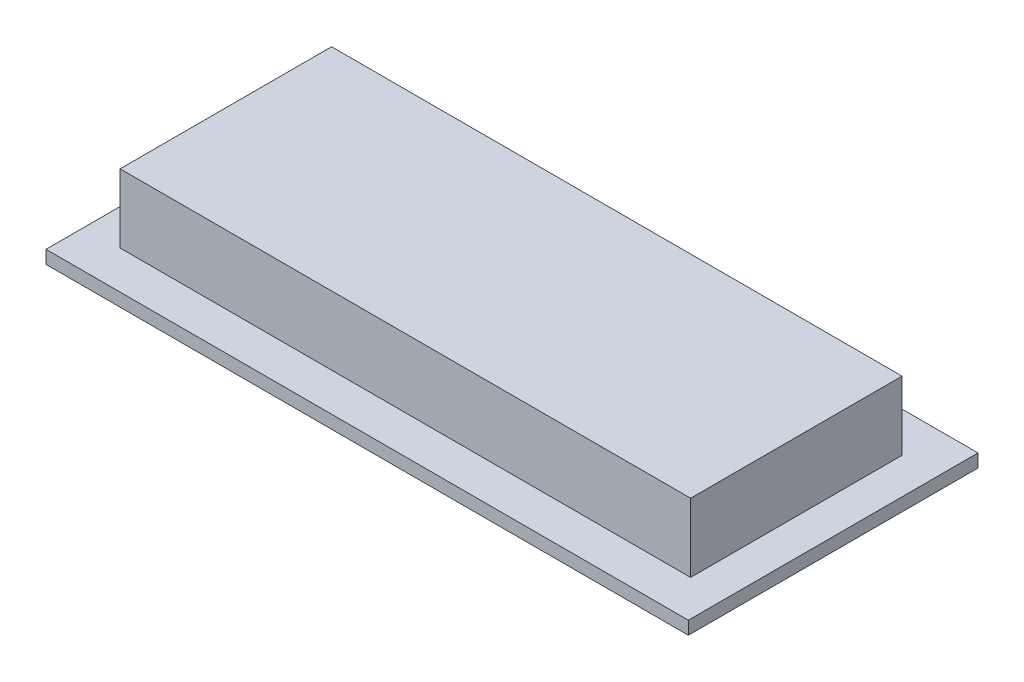
ISO-10303-21;
HEADER;
FILE_DESCRIPTION(('STEP AP214'),'2;1');
FILE_NAME('part.step','',(''),(''),'','','');
FILE_SCHEMA(('AUTOMOTIVE_DESIGN { 1 0 10303 214 1 1 1 1 }'));
ENDSEC;
DATA;
#1=APPLICATION_CONTEXT('core data for automotive mechanical design processes');
#2=APPLICATION_PROTOCOL_DEFINITION('international standard','automotive_design',2000,#1);
#3=PRODUCT_CONTEXT('',#1,'mechanical');
#4=PRODUCT('Part','Part','',(#3));
#5=PRODUCT_RELATED_PRODUCT_CATEGORY('part','',(#4));
#6=PRODUCT_DEFINITION_FORMATION('','',#4);
#7=PRODUCT_DEFINITION_CONTEXT('part definition',#1,'design');
#8=PRODUCT_DEFINITION('design','',#6,#7);
#9=PRODUCT_DEFINITION_SHAPE('','',#8);
#10=(LENGTH_UNIT() NAMED_UNIT(*) SI_UNIT(.MILLI.,.METRE.));
#11=(NAMED_UNIT(*) PLANE_ANGLE_UNIT() SI_UNIT($,.RADIAN.));
#12=(NAMED_UNIT(*) SI_UNIT($,.STERADIAN.) SOLID_ANGLE_UNIT());
#13=UNCERTAINTY_MEASURE_WITH_UNIT(LENGTH_MEASURE(1.E-05),#10,'distance_accuracy_value','');
#14=(GEOMETRIC_REPRESENTATION_CONTEXT(3) GLOBAL_UNCERTAINTY_ASSIGNED_CONTEXT((#13)) GLOBAL_UNIT_ASSIGNED_CONTEXT((#10,
#11,#12)) REPRESENTATION_CONTEXT('',''));
#15=CARTESIAN_POINT('',(0.,0.,0.));
#16=DIRECTION('',(0.,0.,1.));
#17=DIRECTION('',(1.,0.,0.));
#18=AXIS2_PLACEMENT_3D('',#15,#16,#17);
#19=CARTESIAN_POINT('',(0.,0.,0.));
#20=DIRECTION('',(0.,1.,0.));
#21=DIRECTION('',(0.,0.,1.));
#22=AXIS2_PLACEMENT_3D('',#19,#20,#21);
#23=PLANE('',#22);
#24=DIRECTION('',(0.,0.,1.));
#25=VECTOR('',#24,1.);
#26=CARTESIAN_POINT('',(-39.9669,0.,18.0213));
#27=LINE('',#26,#25);
#28=CARTESIAN_POINT('',(-39.9669,0.,-18.0213));
#29=VERTEX_POINT('',#28);
#30=CARTESIAN_POINT('',(-39.9669,0.,18.0213));
#31=VERTEX_POINT('',#30);
#32=EDGE_CURVE('E180',#29,#31,#27,.T.);
#33=ORIENTED_EDGE('',*,*,#32,.F.);
#34=DIRECTION('',(-1.,0.,0.));
#35=VECTOR('',#34,1.);
#36=CARTESIAN_POINT('',(39.9669,0.,-18.0213));
#37=LINE('',#36,#35);
#38=CARTESIAN_POINT('',(39.9669,0.,-18.0213));
#39=VERTEX_POINT('',#38);
#40=EDGE_CURVE('E185',#39,#29,#37,.T.);
#41=ORIENTED_EDGE('',*,*,#40,.F.);
#42=DIRECTION('',(0.,0.,-1.));
#43=VECTOR('',#42,1.);
#44=CARTESIAN_POINT('',(39.9669,0.,18.0213));
#45=LINE('',#44,#43);
#46=CARTESIAN_POINT('',(39.9669,0.,18.0213));
#47=VERTEX_POINT('',#46);
#48=EDGE_CURVE('E196',#47,#39,#45,.T.);
#49=ORIENTED_EDGE('',*,*,#48,.F.);
#50=DIRECTION('',(1.,0.,0.));
#51=VECTOR('',#50,1.);
#52=CARTESIAN_POINT('',(39.9669,0.,18.0213));
#53=LINE('',#52,#51);
#54=EDGE_CURVE('E194',#31,#47,#53,.T.);
#55=ORIENTED_EDGE('',*,*,#54,.F.);
#56=EDGE_LOOP('',(#33,#41,#49,#55));
#57=FACE_BOUND('',#56,.T.);
#58=DIRECTION('',(0.,0.,-1.));
#59=VECTOR('',#58,1.);
#60=CARTESIAN_POINT('',(-33.2359,0.,-16.9799));
#61=LINE('',#60,#59);
#62=CARTESIAN_POINT('',(-33.2359,0.,-14.4399));
#63=VERTEX_POINT('',#62);
#64=CARTESIAN_POINT('',(-33.2359,0.,-16.9799));
#65=VERTEX_POINT('',#64);
#66=EDGE_CURVE('E141',#63,#65,#61,.T.);
#67=ORIENTED_EDGE('',*,*,#66,.F.);
#68=DIRECTION('',(-1.,0.,0.));
#69=VECTOR('',#68,1.);
#70=CARTESIAN_POINT('',(-33.2359,0.,-14.4399));
#71=LINE('',#70,#69);
#72=CARTESIAN_POINT('',(7.4041,0.,-14.4399));
#73=VERTEX_POINT('',#72);
#74=EDGE_CURVE('E138',#73,#63,#71,.T.);
#75=ORIENTED_EDGE('',*,*,#74,.F.);
#76=DIRECTION('',(0.,0.,1.));
#77=VECTOR('',#76,1.);
#78=CARTESIAN_POINT('',(7.4041,0.,-16.9799));
#79=LINE('',#78,#77);
#80=CARTESIAN_POINT('',(7.4041,0.,-16.9799));
#81=VERTEX_POINT('',#80);
#82=EDGE_CURVE('E52',#81,#73,#79,.T.);
#83=ORIENTED_EDGE('',*,*,#82,.F.);
#84=DIRECTION('',(1.,0.,0.));
#85=VECTOR('',#84,1.);
#86=CARTESIAN_POINT('',(-33.2359,0.,-16.9799));
#87=LINE('',#86,#85);
#88=EDGE_CURVE('E47',#65,#81,#87,.T.);
#89=ORIENTED_EDGE('',*,*,#88,.F.);
#90=EDGE_LOOP('',(#67,#75,#83,#89));
#91=FACE_BOUND('',#90,.T.);
#92=ADVANCED_FACE('F32',(#57,#91),#23,.F.);
#93=CARTESIAN_POINT('',(-39.9669,1.6256,18.0213));
#94=DIRECTION('',(1.,0.,0.));
#95=DIRECTION('',(0.,0.,-1.));
#96=AXIS2_PLACEMENT_3D('',#93,#94,#95);
#97=PLANE('',#96);
#98=ORIENTED_EDGE('',*,*,#32,.T.);
#99=DIRECTION('',(0.,-1.,0.));
#100=VECTOR('',#99,1.);
#101=CARTESIAN_POINT('',(-39.9669,1.6256,18.0213));
#102=LINE('',#101,#100);
#103=CARTESIAN_POINT('',(-39.9669,1.6256,18.0213));
#104=VERTEX_POINT('',#103);
#105=EDGE_CURVE('E11',#104,#31,#102,.T.);
#106=ORIENTED_EDGE('',*,*,#105,.F.);
#107=DIRECTION('',(0.,0.,1.));
#108=VECTOR('',#107,1.);
#109=CARTESIAN_POINT('',(-39.9669,1.6256,18.0213));
#110=LINE('',#109,#108);
#111=CARTESIAN_POINT('',(-39.9669,1.6256,-18.0213));
#112=VERTEX_POINT('',#111);
#113=EDGE_CURVE('E181',#112,#104,#110,.T.);
#114=ORIENTED_EDGE('',*,*,#113,.F.);
#115=DIRECTION('',(0.,-1.,0.));
#116=VECTOR('',#115,1.);
#117=CARTESIAN_POINT('',(-39.9669,1.6256,-18.0213));
#118=LINE('',#117,#116);
#119=EDGE_CURVE('E191',#112,#29,#118,.T.);
#120=ORIENTED_EDGE('',*,*,#119,.T.);
#121=EDGE_LOOP('',(#98,#106,#114,#120));
#122=FACE_BOUND('',#121,.T.);
#123=ADVANCED_FACE('F34',(#122),#97,.F.);
#124=CARTESIAN_POINT('',(39.9669,1.6256,18.0213));
#125=DIRECTION('',(0.,0.,-1.));
#126=DIRECTION('',(-1.,0.,0.));
#127=AXIS2_PLACEMENT_3D('',#124,#125,#126);
#128=PLANE('',#127);
#129=ORIENTED_EDGE('',*,*,#54,.T.);
#130=DIRECTION('',(0.,-1.,0.));
#131=VECTOR('',#130,1.);
#132=CARTESIAN_POINT('',(39.9669,1.6256,18.0213));
#133=LINE('',#132,#131);
#134=CARTESIAN_POINT('',(39.9669,1.6256,18.0213));
#135=VERTEX_POINT('',#134);
#136=EDGE_CURVE('E40',#135,#47,#133,.T.);
#137=ORIENTED_EDGE('',*,*,#136,.F.);
#138=DIRECTION('',(1.,0.,0.));
#139=VECTOR('',#138,1.);
#140=CARTESIAN_POINT('',(39.9669,1.6256,18.0213));
#141=LINE('',#140,#139);
#142=EDGE_CURVE('E184',#104,#135,#141,.T.);
#143=ORIENTED_EDGE('',*,*,#142,.F.);
#144=ORIENTED_EDGE('',*,*,#105,.T.);
#145=EDGE_LOOP('',(#129,#137,#143,#144));
#146=FACE_BOUND('',#145,.T.);
#147=ADVANCED_FACE('F223',(#146),#128,.F.);
#148=CARTESIAN_POINT('',(39.9669,1.6256,18.0213));
#149=DIRECTION('',(-1.,0.,0.));
#150=DIRECTION('',(0.,0.,1.));
#151=AXIS2_PLACEMENT_3D('',#148,#149,#150);
#152=PLANE('',#151);
#153=ORIENTED_EDGE('',*,*,#48,.T.);
#154=DIRECTION('',(0.,-1.,0.));
#155=VECTOR('',#154,1.);
#156=CARTESIAN_POINT('',(39.9669,1.6256,-18.0213));
#157=LINE('',#156,#155);
#158=CARTESIAN_POINT('',(39.9669,1.6256,-18.0213));
#159=VERTEX_POINT('',#158);
#160=EDGE_CURVE('E201',#159,#39,#157,.T.);
#161=ORIENTED_EDGE('',*,*,#160,.F.);
#162=DIRECTION('',(0.,0.,-1.));
#163=VECTOR('',#162,1.);
#164=CARTESIAN_POINT('',(39.9669,1.6256,18.0213));
#165=LINE('',#164,#163);
#166=EDGE_CURVE('E187',#135,#159,#165,.T.);
#167=ORIENTED_EDGE('',*,*,#166,.F.);
#168=ORIENTED_EDGE('',*,*,#136,.T.);
#169=EDGE_LOOP('',(#153,#161,#167,#168));
#170=FACE_BOUND('',#169,.T.);
#171=ADVANCED_FACE('F208',(#170),#152,.F.);
#172=CARTESIAN_POINT('',(39.9669,1.6256,-18.0213));
#173=DIRECTION('',(0.,0.,1.));
#174=DIRECTION('',(1.,0.,0.));
#175=AXIS2_PLACEMENT_3D('',#172,#173,#174);
#176=PLANE('',#175);
#177=ORIENTED_EDGE('',*,*,#40,.T.);
#178=ORIENTED_EDGE('',*,*,#119,.F.);
#179=DIRECTION('',(-1.,0.,0.));
#180=VECTOR('',#179,1.);
#181=CARTESIAN_POINT('',(39.9669,1.6256,-18.0213));
#182=LINE('',#181,#180);
#183=EDGE_CURVE('E189',#159,#112,#182,.T.);
#184=ORIENTED_EDGE('',*,*,#183,.F.);
#185=ORIENTED_EDGE('',*,*,#160,.T.);
#186=EDGE_LOOP('',(#177,#178,#184,#185));
#187=FACE_BOUND('',#186,.T.);
#188=ADVANCED_FACE('F216',(#187),#176,.F.);
#189=CARTESIAN_POINT('',(0.,1.6256,0.));
#190=DIRECTION('',(0.,1.,0.));
#191=DIRECTION('',(0.,0.,1.));
#192=AXIS2_PLACEMENT_3D('',#189,#190,#191);
#193=PLANE('',#192);
#194=DIRECTION('',(0.,0.,1.));
#195=VECTOR('',#194,1.);
#196=CARTESIAN_POINT('',(-35.4965,1.6256,13.2715));
#197=LINE('',#196,#195);
#198=CARTESIAN_POINT('',(-35.4965,1.6256,-13.0429));
#199=VERTEX_POINT('',#198);
#200=CARTESIAN_POINT('',(-35.4965,1.6256,13.2715));
#201=VERTEX_POINT('',#200);
#202=EDGE_CURVE('E142',#199,#201,#197,.T.);
#203=ORIENTED_EDGE('',*,*,#202,.F.);
#204=DIRECTION('',(-1.,0.,0.));
#205=VECTOR('',#204,1.);
#206=CARTESIAN_POINT('',(35.4965,1.6256,-13.0429));
#207=LINE('',#206,#205);
#208=CARTESIAN_POINT('',(35.4965,1.6256,-13.0429));
#209=VERTEX_POINT('',#208);
#210=EDGE_CURVE('E155',#209,#199,#207,.T.);
#211=ORIENTED_EDGE('',*,*,#210,.F.);
#212=DIRECTION('',(0.,0.,-1.));
#213=VECTOR('',#212,1.);
#214=CARTESIAN_POINT('',(35.4965,1.6256,13.2715));
#215=LINE('',#214,#213);
#216=CARTESIAN_POINT('',(35.4965,1.6256,13.2715));
#217=VERTEX_POINT('',#216);
#218=EDGE_CURVE('E164',#217,#209,#215,.T.);
#219=ORIENTED_EDGE('',*,*,#218,.F.);
#220=DIRECTION('',(1.,0.,0.));
#221=VECTOR('',#220,1.);
#222=CARTESIAN_POINT('',(35.4965,1.6256,13.2715));
#223=LINE('',#222,#221);
#224=EDGE_CURVE('E145',#201,#217,#223,.T.);
#225=ORIENTED_EDGE('',*,*,#224,.F.);
#226=EDGE_LOOP('',(#203,#211,#219,#225));
#227=FACE_BOUND('',#226,.T.);
#228=ORIENTED_EDGE('',*,*,#113,.T.);
#229=ORIENTED_EDGE('',*,*,#142,.T.);
#230=ORIENTED_EDGE('',*,*,#166,.T.);
#231=ORIENTED_EDGE('',*,*,#183,.T.);
#232=EDGE_LOOP('',(#228,#229,#230,#231));
#233=FACE_BOUND('',#232,.T.);
#234=ADVANCED_FACE('F222',(#227,#233),#193,.T.);
#235=CARTESIAN_POINT('',(-35.4965,10.16,13.2715));
#236=DIRECTION('',(1.,0.,0.));
#237=DIRECTION('',(0.,0.,-1.));
#238=AXIS2_PLACEMENT_3D('',#235,#236,#237);
#239=PLANE('',#238);
#240=ORIENTED_EDGE('',*,*,#202,.T.);
#241=DIRECTION('',(0.,-1.,0.));
#242=VECTOR('',#241,1.);
#243=CARTESIAN_POINT('',(-35.4965,10.16,13.2715));
#244=LINE('',#243,#242);
#245=CARTESIAN_POINT('',(-35.4965,10.16,13.2715));
#246=VERTEX_POINT('',#245);
#247=EDGE_CURVE('E177',#246,#201,#244,.T.);
#248=ORIENTED_EDGE('',*,*,#247,.F.);
#249=DIRECTION('',(0.,0.,1.));
#250=VECTOR('',#249,1.);
#251=CARTESIAN_POINT('',(-35.4965,10.16,13.2715));
#252=LINE('',#251,#250);
#253=CARTESIAN_POINT('',(-35.4965,10.16,-13.0429));
#254=VERTEX_POINT('',#253);
#255=EDGE_CURVE('E151',#254,#246,#252,.T.);
#256=ORIENTED_EDGE('',*,*,#255,.F.);
#257=DIRECTION('',(0.,-1.,0.));
#258=VECTOR('',#257,1.);
#259=CARTESIAN_POINT('',(-35.4965,10.16,-13.0429));
#260=LINE('',#259,#258);
#261=EDGE_CURVE('E160',#254,#199,#260,.T.);
#262=ORIENTED_EDGE('',*,*,#261,.T.);
#263=EDGE_LOOP('',(#240,#248,#256,#262));
#264=FACE_BOUND('',#263,.T.);
#265=ADVANCED_FACE('F241',(#264),#239,.F.);
#266=CARTESIAN_POINT('',(35.4965,10.16,13.2715));
#267=DIRECTION('',(0.,0.,-1.));
#268=DIRECTION('',(-1.,0.,0.));
#269=AXIS2_PLACEMENT_3D('',#266,#267,#268);
#270=PLANE('',#269);
#271=ORIENTED_EDGE('',*,*,#224,.T.);
#272=DIRECTION('',(0.,-1.,0.));
#273=VECTOR('',#272,1.);
#274=CARTESIAN_POINT('',(35.4965,10.16,13.2715));
#275=LINE('',#274,#273);
#276=CARTESIAN_POINT('',(35.4965,10.16,13.2715));
#277=VERTEX_POINT('',#276);
#278=EDGE_CURVE('E174',#277,#217,#275,.T.);
#279=ORIENTED_EDGE('',*,*,#278,.F.);
#280=DIRECTION('',(1.,0.,0.));
#281=VECTOR('',#280,1.);
#282=CARTESIAN_POINT('',(35.4965,10.16,13.2715));
#283=LINE('',#282,#281);
#284=EDGE_CURVE('E154',#246,#277,#283,.T.);
#285=ORIENTED_EDGE('',*,*,#284,.F.);
#286=ORIENTED_EDGE('',*,*,#247,.T.);
#287=EDGE_LOOP('',(#271,#279,#285,#286));
#288=FACE_BOUND('',#287,.T.);
#289=ADVANCED_FACE('F246',(#288),#270,.F.);
#290=CARTESIAN_POINT('',(35.4965,10.16,13.2715));
#291=DIRECTION('',(-1.,0.,0.));
#292=DIRECTION('',(0.,0.,1.));
#293=AXIS2_PLACEMENT_3D('',#290,#291,#292);
#294=PLANE('',#293);
#295=ORIENTED_EDGE('',*,*,#218,.T.);
#296=DIRECTION('',(0.,-1.,0.));
#297=VECTOR('',#296,1.);
#298=CARTESIAN_POINT('',(35.4965,10.16,-13.0429));
#299=LINE('',#298,#297);
#300=CARTESIAN_POINT('',(35.4965,10.16,-13.0429));
#301=VERTEX_POINT('',#300);
#302=EDGE_CURVE('E171',#301,#209,#299,.T.);
#303=ORIENTED_EDGE('',*,*,#302,.F.);
#304=DIRECTION('',(0.,0.,-1.));
#305=VECTOR('',#304,1.);
#306=CARTESIAN_POINT('',(35.4965,10.16,13.2715));
#307=LINE('',#306,#305);
#308=EDGE_CURVE('E157',#277,#301,#307,.T.);
#309=ORIENTED_EDGE('',*,*,#308,.F.);
#310=ORIENTED_EDGE('',*,*,#278,.T.);
#311=EDGE_LOOP('',(#295,#303,#309,#310));
#312=FACE_BOUND('',#311,.T.);
#313=ADVANCED_FACE('F260',(#312),#294,.F.);
#314=CARTESIAN_POINT('',(35.4965,10.16,-13.0429));
#315=DIRECTION('',(0.,0.,1.));
#316=DIRECTION('',(1.,0.,0.));
#317=AXIS2_PLACEMENT_3D('',#314,#315,#316);
#318=PLANE('',#317);
#319=ORIENTED_EDGE('',*,*,#210,.T.);
#320=ORIENTED_EDGE('',*,*,#261,.F.);
#321=DIRECTION('',(-1.,0.,0.));
#322=VECTOR('',#321,1.);
#323=CARTESIAN_POINT('',(35.4965,10.16,-13.0429));
#324=LINE('',#323,#322);
#325=EDGE_CURVE('E159',#301,#254,#324,.T.);
#326=ORIENTED_EDGE('',*,*,#325,.F.);
#327=ORIENTED_EDGE('',*,*,#302,.T.);
#328=EDGE_LOOP('',(#319,#320,#326,#327));
#329=FACE_BOUND('',#328,.T.);
#330=ADVANCED_FACE('F251',(#329),#318,.F.);
#331=CARTESIAN_POINT('',(0.,10.16,0.));
#332=DIRECTION('',(0.,1.,0.));
#333=DIRECTION('',(0.,0.,1.));
#334=AXIS2_PLACEMENT_3D('',#331,#332,#333);
#335=PLANE('',#334);
#336=ORIENTED_EDGE('',*,*,#255,.T.);
#337=ORIENTED_EDGE('',*,*,#284,.T.);
#338=ORIENTED_EDGE('',*,*,#308,.T.);
#339=ORIENTED_EDGE('',*,*,#325,.T.);
#340=EDGE_LOOP('',(#336,#337,#338,#339));
#341=FACE_BOUND('',#340,.T.);
#342=ADVANCED_FACE('F256',(#341),#335,.T.);
#343=CARTESIAN_POINT('',(-33.2359,-8.3312,-16.9799));
#344=DIRECTION('',(1.,0.,0.));
#345=DIRECTION('',(0.,0.,-1.));
#346=AXIS2_PLACEMENT_3D('',#343,#344,#345);
#347=PLANE('',#346);
#348=ORIENTED_EDGE('',*,*,#66,.T.);
#349=DIRECTION('',(0.,1.,0.));
#350=VECTOR('',#349,1.);
#351=CARTESIAN_POINT('',(-33.2359,-8.3312,-16.9799));
#352=LINE('',#351,#350);
#353=CARTESIAN_POINT('',(-33.2359,-8.3312,-16.9799));
#354=VERTEX_POINT('',#353);
#355=EDGE_CURVE('E122',#354,#65,#352,.T.);
#356=ORIENTED_EDGE('',*,*,#355,.F.);
#357=DIRECTION('',(0.,0.,-1.));
#358=VECTOR('',#357,1.);
#359=CARTESIAN_POINT('',(-33.2359,-8.3312,-16.9799));
#360=LINE('',#359,#358);
#361=CARTESIAN_POINT('',(-33.2359,-8.3312,-14.4399));
#362=VERTEX_POINT('',#361);
#363=EDGE_CURVE('E129',#362,#354,#360,.T.);
#364=ORIENTED_EDGE('',*,*,#363,.F.);
#365=DIRECTION('',(0.,1.,0.));
#366=VECTOR('',#365,1.);
#367=CARTESIAN_POINT('',(-33.2359,-8.3312,-14.4399));
#368=LINE('',#367,#366);
#369=EDGE_CURVE('E374',#362,#63,#368,.T.);
#370=ORIENTED_EDGE('',*,*,#369,.T.);
#371=EDGE_LOOP('',(#348,#356,#364,#370));
#372=FACE_BOUND('',#371,.T.);
#373=ADVANCED_FACE('F140',(#372),#347,.F.);
#374=CARTESIAN_POINT('',(-33.2359,-8.3312,-16.9799));
#375=DIRECTION('',(0.,0.,1.));
#376=DIRECTION('',(1.,0.,0.));
#377=AXIS2_PLACEMENT_3D('',#374,#375,#376);
#378=PLANE('',#377);
#379=ORIENTED_EDGE('',*,*,#88,.T.);
#380=DIRECTION('',(0.,1.,0.));
#381=VECTOR('',#380,1.);
#382=CARTESIAN_POINT('',(7.4041,-8.3312,-16.9799));
#383=LINE('',#382,#381);
#384=CARTESIAN_POINT('',(7.4041,-8.3312,-16.9799));
#385=VERTEX_POINT('',#384);
#386=EDGE_CURVE('E125',#385,#81,#383,.T.);
#387=ORIENTED_EDGE('',*,*,#386,.F.);
#388=DIRECTION('',(1.,0.,0.));
#389=VECTOR('',#388,1.);
#390=CARTESIAN_POINT('',(-33.2359,-8.3312,-16.9799));
#391=LINE('',#390,#389);
#392=EDGE_CURVE('E118',#354,#385,#391,.T.);
#393=ORIENTED_EDGE('',*,*,#392,.F.);
#394=ORIENTED_EDGE('',*,*,#355,.T.);
#395=EDGE_LOOP('',(#379,#387,#393,#394));
#396=FACE_BOUND('',#395,.T.);
#397=ADVANCED_FACE('F120',(#396),#378,.F.);
#398=CARTESIAN_POINT('',(7.4041,-8.3312,-16.9799));
#399=DIRECTION('',(-1.,0.,0.));
#400=DIRECTION('',(0.,0.,1.));
#401=AXIS2_PLACEMENT_3D('',#398,#399,#400);
#402=PLANE('',#401);
#403=ORIENTED_EDGE('',*,*,#82,.T.);
#404=DIRECTION('',(0.,1.,0.));
#405=VECTOR('',#404,1.);
#406=CARTESIAN_POINT('',(7.4041,-8.3312,-14.4399));
#407=LINE('',#406,#405);
#408=CARTESIAN_POINT('',(7.4041,-8.3312,-14.4399));
#409=VERTEX_POINT('',#408);
#410=EDGE_CURVE('E147',#409,#73,#407,.T.);
#411=ORIENTED_EDGE('',*,*,#410,.F.);
#412=DIRECTION('',(0.,0.,1.));
#413=VECTOR('',#412,1.);
#414=CARTESIAN_POINT('',(7.4041,-8.3312,-16.9799));
#415=LINE('',#414,#413);
#416=EDGE_CURVE('E128',#385,#409,#415,.T.);
#417=ORIENTED_EDGE('',*,*,#416,.F.);
#418=ORIENTED_EDGE('',*,*,#386,.T.);
#419=EDGE_LOOP('',(#403,#411,#417,#418));
#420=FACE_BOUND('',#419,.T.);
#421=ADVANCED_FACE('F277',(#420),#402,.F.);
#422=CARTESIAN_POINT('',(-33.2359,-8.3312,-14.4399));
#423=DIRECTION('',(0.,0.,-1.));
#424=DIRECTION('',(-1.,0.,0.));
#425=AXIS2_PLACEMENT_3D('',#422,#423,#424);
#426=PLANE('',#425);
#427=ORIENTED_EDGE('',*,*,#74,.T.);
#428=ORIENTED_EDGE('',*,*,#369,.F.);
#429=DIRECTION('',(-1.,0.,0.));
#430=VECTOR('',#429,1.);
#431=CARTESIAN_POINT('',(-33.2359,-8.3312,-14.4399));
#432=LINE('',#431,#430);
#433=EDGE_CURVE('E134',#409,#362,#432,.T.);
#434=ORIENTED_EDGE('',*,*,#433,.F.);
#435=ORIENTED_EDGE('',*,*,#410,.T.);
#436=EDGE_LOOP('',(#427,#428,#434,#435));
#437=FACE_BOUND('',#436,.T.);
#438=ADVANCED_FACE('F280',(#437),#426,.F.);
#439=CARTESIAN_POINT('',(0.,-8.3312,0.));
#440=DIRECTION('',(0.,1.,0.));
#441=DIRECTION('',(0.,0.,1.));
#442=AXIS2_PLACEMENT_3D('',#439,#440,#441);
#443=PLANE('',#442);
#444=ORIENTED_EDGE('',*,*,#363,.T.);
#445=ORIENTED_EDGE('',*,*,#392,.T.);
#446=ORIENTED_EDGE('',*,*,#416,.T.);
#447=ORIENTED_EDGE('',*,*,#433,.T.);
#448=EDGE_LOOP('',(#444,#445,#446,#447));
#449=FACE_BOUND('',#448,.T.);
#450=ADVANCED_FACE('F132',(#449),#443,.F.);
#451=CLOSED_SHELL('',(#92,#123,#147,#171,#188,#234,#265,#289,#313,#330,#342,#373,#397,#421,#438,#450));
#452=MANIFOLD_SOLID_BREP('B2',#451);
#453=ADVANCED_BREP_SHAPE_REPRESENTATION('',(#18,#452),#14);
#454=SHAPE_DEFINITION_REPRESENTATION(#9,#453);
ENDSEC;
END-ISO-10303-21;
